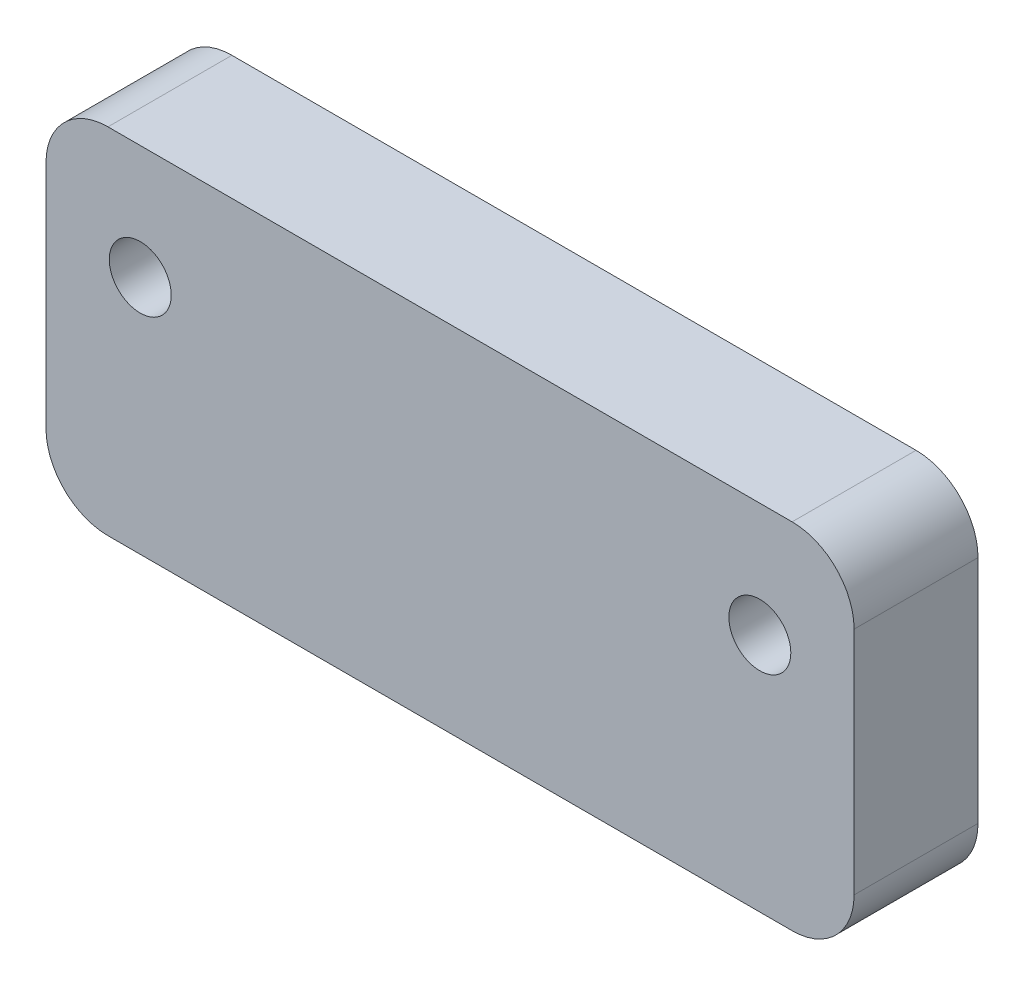
ISO-10303-21;
HEADER;
FILE_DESCRIPTION(('STEP AP214'),'2;1');
FILE_NAME('part.step','',(''),(''),'','','');
FILE_SCHEMA(('AUTOMOTIVE_DESIGN { 1 0 10303 214 1 1 1 1 }'));
ENDSEC;
DATA;
#1=APPLICATION_CONTEXT('core data for automotive mechanical design processes');
#2=APPLICATION_PROTOCOL_DEFINITION('international standard','automotive_design',2000,#1);
#3=PRODUCT_CONTEXT('',#1,'mechanical');
#4=PRODUCT('Part','Part','',(#3));
#5=PRODUCT_RELATED_PRODUCT_CATEGORY('part','',(#4));
#6=PRODUCT_DEFINITION_FORMATION('','',#4);
#7=PRODUCT_DEFINITION_CONTEXT('part definition',#1,'design');
#8=PRODUCT_DEFINITION('design','',#6,#7);
#9=PRODUCT_DEFINITION_SHAPE('','',#8);
#10=(LENGTH_UNIT() NAMED_UNIT(*) SI_UNIT(.MILLI.,.METRE.));
#11=(NAMED_UNIT(*) PLANE_ANGLE_UNIT() SI_UNIT($,.RADIAN.));
#12=(NAMED_UNIT(*) SI_UNIT($,.STERADIAN.) SOLID_ANGLE_UNIT());
#13=UNCERTAINTY_MEASURE_WITH_UNIT(LENGTH_MEASURE(1.E-05),#10,'distance_accuracy_value','');
#14=(GEOMETRIC_REPRESENTATION_CONTEXT(3) GLOBAL_UNCERTAINTY_ASSIGNED_CONTEXT((#13)) GLOBAL_UNIT_ASSIGNED_CONTEXT((#10,
#11,#12)) REPRESENTATION_CONTEXT('',''));
#15=CARTESIAN_POINT('',(0.,0.,0.));
#16=DIRECTION('',(0.,0.,1.));
#17=DIRECTION('',(1.,0.,0.));
#18=AXIS2_PLACEMENT_3D('',#15,#16,#17);
#19=CARTESIAN_POINT('',(37.4646544011045,-99.4269146962741,10.));
#20=DIRECTION('',(0.,0.,1.));
#21=DIRECTION('',(1.,0.,0.));
#22=AXIS2_PLACEMENT_3D('',#19,#20,#21);
#23=PLANE('',#22);
#24=CARTESIAN_POINT('',(90.0700000000032,-85.0655810765651,10.));
#25=DIRECTION('',(0.,0.,1.));
#26=DIRECTION('',(1.,0.,0.));
#27=AXIS2_PLACEMENT_3D('',#24,#25,#26);
#28=CIRCLE('',#27,2.5);
#29=CARTESIAN_POINT('',(92.5700000000032,-85.0655810765651,10.));
#30=VERTEX_POINT('',#29);
#31=EDGE_CURVE('E140',#30,#30,#28,.T.);
#32=ORIENTED_EDGE('',*,*,#31,.F.);
#33=EDGE_LOOP('',(#32));
#34=FACE_BOUND('',#33,.T.);
#35=CARTESIAN_POINT('',(37.4646544011045,-99.4269146962741,10.));
#36=DIRECTION('',(0.,0.,1.));
#37=DIRECTION('',(1.,0.,0.));
#38=AXIS2_PLACEMENT_3D('',#35,#36,#37);
#39=CIRCLE('',#38,5.);
#40=CARTESIAN_POINT('',(32.4646544011045,-99.4269146962741,10.));
#41=VERTEX_POINT('',#40);
#42=CARTESIAN_POINT('',(37.4646544011045,-104.426914696274,10.));
#43=VERTEX_POINT('',#42);
#44=EDGE_CURVE('E151',#41,#43,#39,.T.);
#45=ORIENTED_EDGE('',*,*,#44,.T.);
#46=DIRECTION('',(1.,0.,0.));
#47=VECTOR('',#46,1.);
#48=CARTESIAN_POINT('',(37.4646544011045,-104.426914696274,10.));
#49=LINE('',#48,#47);
#50=CARTESIAN_POINT('',(92.6753455989019,-104.426914696274,10.));
#51=VERTEX_POINT('',#50);
#52=EDGE_CURVE('E99',#43,#51,#49,.T.);
#53=ORIENTED_EDGE('',*,*,#52,.T.);
#54=CARTESIAN_POINT('',(92.675345598902,-99.4269146962741,10.));
#55=DIRECTION('',(0.,0.,1.));
#56=DIRECTION('',(-1.,0.,0.));
#57=AXIS2_PLACEMENT_3D('',#54,#55,#56);
#58=CIRCLE('',#57,5.);
#59=CARTESIAN_POINT('',(97.675345598902,-99.4269146962741,10.));
#60=VERTEX_POINT('',#59);
#61=EDGE_CURVE('E166',#51,#60,#58,.T.);
#62=ORIENTED_EDGE('',*,*,#61,.T.);
#63=DIRECTION('',(0.,1.,0.));
#64=VECTOR('',#63,1.);
#65=CARTESIAN_POINT('',(97.675345598902,-80.8520244972496,10.));
#66=LINE('',#65,#64);
#67=CARTESIAN_POINT('',(97.675345598902,-80.8520244972496,10.));
#68=VERTEX_POINT('',#67);
#69=EDGE_CURVE('E179',#60,#68,#66,.T.);
#70=ORIENTED_EDGE('',*,*,#69,.T.);
#71=CARTESIAN_POINT('',(92.675345598902,-80.8520244972495,10.));
#72=DIRECTION('',(0.,0.,1.));
#73=DIRECTION('',(1.,0.,0.));
#74=AXIS2_PLACEMENT_3D('',#71,#72,#73);
#75=CIRCLE('',#74,5.);
#76=CARTESIAN_POINT('',(92.6753455989019,-75.8520244972495,10.));
#77=VERTEX_POINT('',#76);
#78=EDGE_CURVE('E118',#68,#77,#75,.T.);
#79=ORIENTED_EDGE('',*,*,#78,.T.);
#80=DIRECTION('',(-1.,0.,0.));
#81=VECTOR('',#80,1.);
#82=CARTESIAN_POINT('',(37.4646544011045,-75.8520244972495,10.));
#83=LINE('',#82,#81);
#84=CARTESIAN_POINT('',(37.4646544011045,-75.8520244972495,10.));
#85=VERTEX_POINT('',#84);
#86=EDGE_CURVE('E112',#77,#85,#83,.T.);
#87=ORIENTED_EDGE('',*,*,#86,.T.);
#88=CARTESIAN_POINT('',(37.4646544011044,-80.8520244972495,10.));
#89=DIRECTION('',(0.,0.,1.));
#90=DIRECTION('',(1.,0.,0.));
#91=AXIS2_PLACEMENT_3D('',#88,#89,#90);
#92=CIRCLE('',#91,5.);
#93=CARTESIAN_POINT('',(32.4646544011045,-80.8520244972496,10.));
#94=VERTEX_POINT('',#93);
#95=EDGE_CURVE('E116',#85,#94,#92,.T.);
#96=ORIENTED_EDGE('',*,*,#95,.T.);
#97=DIRECTION('',(0.,-1.,0.));
#98=VECTOR('',#97,1.);
#99=CARTESIAN_POINT('',(32.4646544011045,-80.8520244972496,10.));
#100=LINE('',#99,#98);
#101=EDGE_CURVE('E56',#94,#41,#100,.T.);
#102=ORIENTED_EDGE('',*,*,#101,.T.);
#103=EDGE_LOOP('',(#45,#53,#62,#70,#79,#87,#96,#102));
#104=FACE_BOUND('',#103,.T.);
#105=CARTESIAN_POINT('',(40.0700000000032,-85.0655810765651,10.));
#106=DIRECTION('',(0.,0.,1.));
#107=DIRECTION('',(1.,0.,0.));
#108=AXIS2_PLACEMENT_3D('',#105,#106,#107);
#109=CIRCLE('',#108,2.5);
#110=CARTESIAN_POINT('',(42.5700000000032,-85.0655810765651,10.));
#111=VERTEX_POINT('',#110);
#112=EDGE_CURVE('E188',#111,#111,#109,.T.);
#113=ORIENTED_EDGE('',*,*,#112,.F.);
#114=EDGE_LOOP('',(#113));
#115=FACE_BOUND('',#114,.T.);
#116=ADVANCED_FACE('F39',(#34,#104,#115),#23,.T.);
#117=CARTESIAN_POINT('',(37.4646544011045,-99.4269146962741,0.));
#118=DIRECTION('',(0.,0.,1.));
#119=DIRECTION('',(1.,0.,0.));
#120=AXIS2_PLACEMENT_3D('',#117,#118,#119);
#121=PLANE('',#120);
#122=CARTESIAN_POINT('',(37.4646544011045,-99.4269146962741,0.));
#123=DIRECTION('',(0.,0.,1.));
#124=DIRECTION('',(1.,0.,0.));
#125=AXIS2_PLACEMENT_3D('',#122,#123,#124);
#126=CIRCLE('',#125,5.);
#127=CARTESIAN_POINT('',(32.4646544011045,-99.4269146962741,0.));
#128=VERTEX_POINT('',#127);
#129=CARTESIAN_POINT('',(37.4646544011045,-104.426914696274,0.));
#130=VERTEX_POINT('',#129);
#131=EDGE_CURVE('E136',#128,#130,#126,.T.);
#132=ORIENTED_EDGE('',*,*,#131,.F.);
#133=DIRECTION('',(0.,-1.,0.));
#134=VECTOR('',#133,1.);
#135=CARTESIAN_POINT('',(32.4646544011045,-80.8520244972496,0.));
#136=LINE('',#135,#134);
#137=CARTESIAN_POINT('',(32.4646544011045,-80.8520244972496,0.));
#138=VERTEX_POINT('',#137);
#139=EDGE_CURVE('E91',#138,#128,#136,.T.);
#140=ORIENTED_EDGE('',*,*,#139,.F.);
#141=CARTESIAN_POINT('',(37.4646544011044,-80.8520244972495,0.));
#142=DIRECTION('',(0.,0.,1.));
#143=DIRECTION('',(1.,0.,0.));
#144=AXIS2_PLACEMENT_3D('',#141,#142,#143);
#145=CIRCLE('',#144,5.);
#146=CARTESIAN_POINT('',(37.4646544011045,-75.8520244972495,0.));
#147=VERTEX_POINT('',#146);
#148=EDGE_CURVE('E85',#147,#138,#145,.T.);
#149=ORIENTED_EDGE('',*,*,#148,.F.);
#150=DIRECTION('',(-1.,0.,0.));
#151=VECTOR('',#150,1.);
#152=CARTESIAN_POINT('',(37.4646544011045,-75.8520244972495,0.));
#153=LINE('',#152,#151);
#154=CARTESIAN_POINT('',(92.6753455989019,-75.8520244972495,0.));
#155=VERTEX_POINT('',#154);
#156=EDGE_CURVE('E126',#155,#147,#153,.T.);
#157=ORIENTED_EDGE('',*,*,#156,.F.);
#158=CARTESIAN_POINT('',(92.675345598902,-80.8520244972495,0.));
#159=DIRECTION('',(0.,0.,1.));
#160=DIRECTION('',(1.,0.,0.));
#161=AXIS2_PLACEMENT_3D('',#158,#159,#160);
#162=CIRCLE('',#161,5.);
#163=CARTESIAN_POINT('',(97.675345598902,-80.8520244972496,0.));
#164=VERTEX_POINT('',#163);
#165=EDGE_CURVE('E146',#164,#155,#162,.T.);
#166=ORIENTED_EDGE('',*,*,#165,.F.);
#167=DIRECTION('',(0.,1.,0.));
#168=VECTOR('',#167,1.);
#169=CARTESIAN_POINT('',(97.675345598902,-80.8520244972496,0.));
#170=LINE('',#169,#168);
#171=CARTESIAN_POINT('',(97.675345598902,-99.4269146962741,0.));
#172=VERTEX_POINT('',#171);
#173=EDGE_CURVE('E144',#172,#164,#170,.T.);
#174=ORIENTED_EDGE('',*,*,#173,.F.);
#175=CARTESIAN_POINT('',(92.675345598902,-99.4269146962741,0.));
#176=DIRECTION('',(0.,0.,1.));
#177=DIRECTION('',(-1.,0.,0.));
#178=AXIS2_PLACEMENT_3D('',#175,#176,#177);
#179=CIRCLE('',#178,5.);
#180=CARTESIAN_POINT('',(92.6753455989019,-104.426914696274,0.));
#181=VERTEX_POINT('',#180);
#182=EDGE_CURVE('E142',#181,#172,#179,.T.);
#183=ORIENTED_EDGE('',*,*,#182,.F.);
#184=DIRECTION('',(1.,0.,0.));
#185=VECTOR('',#184,1.);
#186=CARTESIAN_POINT('',(37.4646544011045,-104.426914696274,0.));
#187=LINE('',#186,#185);
#188=EDGE_CURVE('E139',#130,#181,#187,.T.);
#189=ORIENTED_EDGE('',*,*,#188,.F.);
#190=EDGE_LOOP('',(#132,#140,#149,#157,#166,#174,#183,#189));
#191=FACE_BOUND('',#190,.T.);
#192=CARTESIAN_POINT('',(90.0700000000032,-85.0655810765651,0.));
#193=DIRECTION('',(0.,0.,1.));
#194=DIRECTION('',(1.,0.,0.));
#195=AXIS2_PLACEMENT_3D('',#192,#193,#194);
#196=CIRCLE('',#195,2.5);
#197=CARTESIAN_POINT('',(92.5700000000032,-85.0655810765651,0.));
#198=VERTEX_POINT('',#197);
#199=EDGE_CURVE('E185',#198,#198,#196,.T.);
#200=ORIENTED_EDGE('',*,*,#199,.T.);
#201=EDGE_LOOP('',(#200));
#202=FACE_BOUND('',#201,.T.);
#203=CARTESIAN_POINT('',(40.0700000000032,-85.0655810765651,0.));
#204=DIRECTION('',(0.,0.,1.));
#205=DIRECTION('',(1.,0.,0.));
#206=AXIS2_PLACEMENT_3D('',#203,#204,#205);
#207=CIRCLE('',#206,2.5);
#208=CARTESIAN_POINT('',(42.5700000000032,-85.0655810765651,0.));
#209=VERTEX_POINT('',#208);
#210=EDGE_CURVE('E191',#209,#209,#207,.T.);
#211=ORIENTED_EDGE('',*,*,#210,.T.);
#212=EDGE_LOOP('',(#211));
#213=FACE_BOUND('',#212,.T.);
#214=ADVANCED_FACE('F170',(#191,#202,#213),#121,.F.);
#215=CARTESIAN_POINT('',(37.4646544011045,-99.4269146962741,10.));
#216=DIRECTION('',(0.,0.,-1.));
#217=DIRECTION('',(-1.,0.,0.));
#218=AXIS2_PLACEMENT_3D('',#215,#216,#217);
#219=CYLINDRICAL_SURFACE('',#218,5.);
#220=ORIENTED_EDGE('',*,*,#131,.T.);
#221=DIRECTION('',(0.,0.,-1.));
#222=VECTOR('',#221,1.);
#223=CARTESIAN_POINT('',(37.4646544011045,-104.426914696274,10.));
#224=LINE('',#223,#222);
#225=EDGE_CURVE('E11',#43,#130,#224,.T.);
#226=ORIENTED_EDGE('',*,*,#225,.F.);
#227=ORIENTED_EDGE('',*,*,#44,.F.);
#228=DIRECTION('',(0.,0.,-1.));
#229=VECTOR('',#228,1.);
#230=CARTESIAN_POINT('',(32.4646544011045,-99.4269146962741,10.));
#231=LINE('',#230,#229);
#232=EDGE_CURVE('E132',#41,#128,#231,.T.);
#233=ORIENTED_EDGE('',*,*,#232,.T.);
#234=EDGE_LOOP('',(#220,#226,#227,#233));
#235=FACE_BOUND('',#234,.T.);
#236=ADVANCED_FACE('F41',(#235),#219,.T.);
#237=CARTESIAN_POINT('',(37.4646544011045,-104.426914696274,10.));
#238=DIRECTION('',(0.,1.,0.));
#239=DIRECTION('',(0.,0.,1.));
#240=AXIS2_PLACEMENT_3D('',#237,#238,#239);
#241=PLANE('',#240);
#242=ORIENTED_EDGE('',*,*,#188,.T.);
#243=DIRECTION('',(0.,0.,-1.));
#244=VECTOR('',#243,1.);
#245=CARTESIAN_POINT('',(92.6753455989019,-104.426914696274,10.));
#246=LINE('',#245,#244);
#247=EDGE_CURVE('E48',#51,#181,#246,.T.);
#248=ORIENTED_EDGE('',*,*,#247,.F.);
#249=ORIENTED_EDGE('',*,*,#52,.F.);
#250=ORIENTED_EDGE('',*,*,#225,.T.);
#251=EDGE_LOOP('',(#242,#248,#249,#250));
#252=FACE_BOUND('',#251,.T.);
#253=ADVANCED_FACE('F223',(#252),#241,.F.);
#254=CARTESIAN_POINT('',(92.675345598902,-99.4269146962741,10.));
#255=DIRECTION('',(0.,0.,-1.));
#256=DIRECTION('',(-1.,0.,0.));
#257=AXIS2_PLACEMENT_3D('',#254,#255,#256);
#258=CYLINDRICAL_SURFACE('',#257,5.);
#259=ORIENTED_EDGE('',*,*,#182,.T.);
#260=DIRECTION('',(0.,0.,-1.));
#261=VECTOR('',#260,1.);
#262=CARTESIAN_POINT('',(97.675345598902,-99.4269146962741,10.));
#263=LINE('',#262,#261);
#264=EDGE_CURVE('E158',#60,#172,#263,.T.);
#265=ORIENTED_EDGE('',*,*,#264,.F.);
#266=ORIENTED_EDGE('',*,*,#61,.F.);
#267=ORIENTED_EDGE('',*,*,#247,.T.);
#268=EDGE_LOOP('',(#259,#265,#266,#267));
#269=FACE_BOUND('',#268,.T.);
#270=ADVANCED_FACE('F164',(#269),#258,.T.);
#271=CARTESIAN_POINT('',(97.675345598902,-80.8520244972496,10.));
#272=DIRECTION('',(-1.,0.,0.));
#273=DIRECTION('',(0.,0.,1.));
#274=AXIS2_PLACEMENT_3D('',#271,#272,#273);
#275=PLANE('',#274);
#276=ORIENTED_EDGE('',*,*,#173,.T.);
#277=DIRECTION('',(0.,0.,-1.));
#278=VECTOR('',#277,1.);
#279=CARTESIAN_POINT('',(97.675345598902,-80.8520244972496,10.));
#280=LINE('',#279,#278);
#281=EDGE_CURVE('E155',#68,#164,#280,.T.);
#282=ORIENTED_EDGE('',*,*,#281,.F.);
#283=ORIENTED_EDGE('',*,*,#69,.F.);
#284=ORIENTED_EDGE('',*,*,#264,.T.);
#285=EDGE_LOOP('',(#276,#282,#283,#284));
#286=FACE_BOUND('',#285,.T.);
#287=ADVANCED_FACE('F175',(#286),#275,.F.);
#288=CARTESIAN_POINT('',(92.675345598902,-80.8520244972495,10.));
#289=DIRECTION('',(0.,0.,-1.));
#290=DIRECTION('',(-1.,0.,0.));
#291=AXIS2_PLACEMENT_3D('',#288,#289,#290);
#292=CYLINDRICAL_SURFACE('',#291,5.);
#293=ORIENTED_EDGE('',*,*,#165,.T.);
#294=DIRECTION('',(0.,0.,-1.));
#295=VECTOR('',#294,1.);
#296=CARTESIAN_POINT('',(92.6753455989019,-75.8520244972495,10.));
#297=LINE('',#296,#295);
#298=EDGE_CURVE('E127',#77,#155,#297,.T.);
#299=ORIENTED_EDGE('',*,*,#298,.F.);
#300=ORIENTED_EDGE('',*,*,#78,.F.);
#301=ORIENTED_EDGE('',*,*,#281,.T.);
#302=EDGE_LOOP('',(#293,#299,#300,#301));
#303=FACE_BOUND('',#302,.T.);
#304=ADVANCED_FACE('F178',(#303),#292,.T.);
#305=CARTESIAN_POINT('',(37.4646544011045,-75.8520244972495,10.));
#306=DIRECTION('',(0.,-1.,0.));
#307=DIRECTION('',(0.,0.,-1.));
#308=AXIS2_PLACEMENT_3D('',#305,#306,#307);
#309=PLANE('',#308);
#310=ORIENTED_EDGE('',*,*,#156,.T.);
#311=DIRECTION('',(0.,0.,-1.));
#312=VECTOR('',#311,1.);
#313=CARTESIAN_POINT('',(37.4646544011045,-75.8520244972495,10.));
#314=LINE('',#313,#312);
#315=EDGE_CURVE('E123',#85,#147,#314,.T.);
#316=ORIENTED_EDGE('',*,*,#315,.F.);
#317=ORIENTED_EDGE('',*,*,#86,.F.);
#318=ORIENTED_EDGE('',*,*,#298,.T.);
#319=EDGE_LOOP('',(#310,#316,#317,#318));
#320=FACE_BOUND('',#319,.T.);
#321=ADVANCED_FACE('F124',(#320),#309,.F.);
#322=CARTESIAN_POINT('',(37.4646544011044,-80.8520244972495,10.));
#323=DIRECTION('',(0.,0.,-1.));
#324=DIRECTION('',(-1.,0.,0.));
#325=AXIS2_PLACEMENT_3D('',#322,#323,#324);
#326=CYLINDRICAL_SURFACE('',#325,5.);
#327=ORIENTED_EDGE('',*,*,#148,.T.);
#328=DIRECTION('',(0.,0.,-1.));
#329=VECTOR('',#328,1.);
#330=CARTESIAN_POINT('',(32.4646544011045,-80.8520244972496,10.));
#331=LINE('',#330,#329);
#332=EDGE_CURVE('E128',#94,#138,#331,.T.);
#333=ORIENTED_EDGE('',*,*,#332,.F.);
#334=ORIENTED_EDGE('',*,*,#95,.F.);
#335=ORIENTED_EDGE('',*,*,#315,.T.);
#336=EDGE_LOOP('',(#327,#333,#334,#335));
#337=FACE_BOUND('',#336,.T.);
#338=ADVANCED_FACE('F130',(#337),#326,.T.);
#339=CARTESIAN_POINT('',(32.4646544011045,-80.8520244972496,10.));
#340=DIRECTION('',(1.,0.,0.));
#341=DIRECTION('',(0.,0.,-1.));
#342=AXIS2_PLACEMENT_3D('',#339,#340,#341);
#343=PLANE('',#342);
#344=ORIENTED_EDGE('',*,*,#139,.T.);
#345=ORIENTED_EDGE('',*,*,#232,.F.);
#346=ORIENTED_EDGE('',*,*,#101,.F.);
#347=ORIENTED_EDGE('',*,*,#332,.T.);
#348=EDGE_LOOP('',(#344,#345,#346,#347));
#349=FACE_BOUND('',#348,.T.);
#350=ADVANCED_FACE('F211',(#349),#343,.F.);
#351=CARTESIAN_POINT('',(90.0700000000032,-85.0655810765651,10.));
#352=DIRECTION('',(0.,0.,-1.));
#353=DIRECTION('',(-1.,0.,0.));
#354=AXIS2_PLACEMENT_3D('',#351,#352,#353);
#355=CYLINDRICAL_SURFACE('',#354,2.5);
#356=ORIENTED_EDGE('',*,*,#31,.T.);
#357=EDGE_LOOP('',(#356));
#358=FACE_BOUND('',#357,.T.);
#359=ORIENTED_EDGE('',*,*,#199,.F.);
#360=EDGE_LOOP('',(#359));
#361=FACE_BOUND('',#360,.T.);
#362=ADVANCED_FACE('F208',(#358,#361),#355,.F.);
#363=CARTESIAN_POINT('',(40.0700000000032,-85.0655810765651,10.));
#364=DIRECTION('',(0.,0.,-1.));
#365=DIRECTION('',(-1.,0.,0.));
#366=AXIS2_PLACEMENT_3D('',#363,#364,#365);
#367=CYLINDRICAL_SURFACE('',#366,2.5);
#368=ORIENTED_EDGE('',*,*,#112,.T.);
#369=EDGE_LOOP('',(#368));
#370=FACE_BOUND('',#369,.T.);
#371=ORIENTED_EDGE('',*,*,#210,.F.);
#372=EDGE_LOOP('',(#371));
#373=FACE_BOUND('',#372,.T.);
#374=ADVANCED_FACE('F197',(#370,#373),#367,.F.);
#375=CLOSED_SHELL('',(#116,#214,#236,#253,#270,#287,#304,#321,#338,#350,#362,#374));
#376=MANIFOLD_SOLID_BREP('B2',#375);
#377=ADVANCED_BREP_SHAPE_REPRESENTATION('',(#18,#376),#14);
#378=SHAPE_DEFINITION_REPRESENTATION(#9,#377);
ENDSEC;
END-ISO-10303-21;
